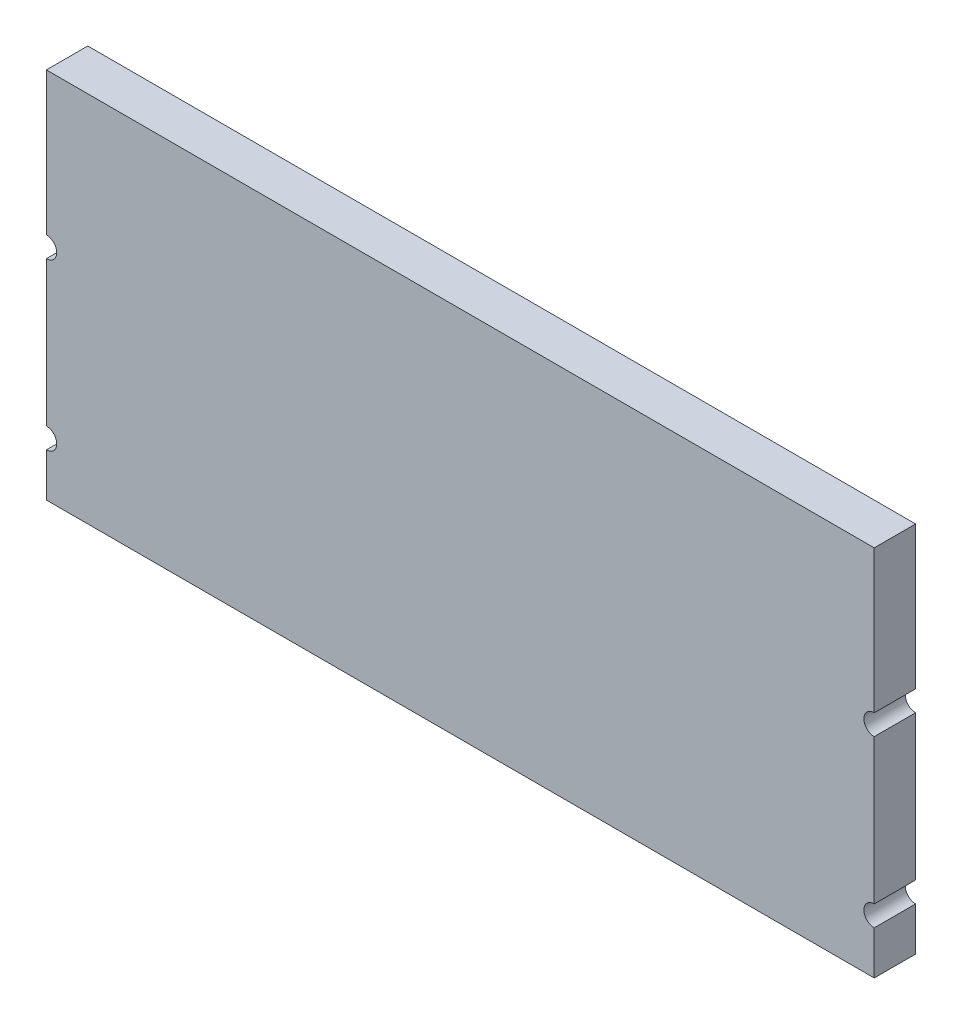
ISO-10303-21;
HEADER;
FILE_DESCRIPTION(('STEP AP214'),'2;1');
FILE_NAME('part.step','',(''),(''),'','','');
FILE_SCHEMA(('AUTOMOTIVE_DESIGN { 1 0 10303 214 1 1 1 1 }'));
ENDSEC;
DATA;
#1=APPLICATION_CONTEXT('core data for automotive mechanical design processes');
#2=APPLICATION_PROTOCOL_DEFINITION('international standard','automotive_design',2000,#1);
#3=PRODUCT_CONTEXT('',#1,'mechanical');
#4=PRODUCT('Part','Part','',(#3));
#5=PRODUCT_RELATED_PRODUCT_CATEGORY('part','',(#4));
#6=PRODUCT_DEFINITION_FORMATION('','',#4);
#7=PRODUCT_DEFINITION_CONTEXT('part definition',#1,'design');
#8=PRODUCT_DEFINITION('design','',#6,#7);
#9=PRODUCT_DEFINITION_SHAPE('','',#8);
#10=(LENGTH_UNIT() NAMED_UNIT(*) SI_UNIT(.MILLI.,.METRE.));
#11=(NAMED_UNIT(*) PLANE_ANGLE_UNIT() SI_UNIT($,.RADIAN.));
#12=(NAMED_UNIT(*) SI_UNIT($,.STERADIAN.) SOLID_ANGLE_UNIT());
#13=UNCERTAINTY_MEASURE_WITH_UNIT(LENGTH_MEASURE(1.E-05),#10,'distance_accuracy_value','');
#14=(GEOMETRIC_REPRESENTATION_CONTEXT(3) GLOBAL_UNCERTAINTY_ASSIGNED_CONTEXT((#13)) GLOBAL_UNIT_ASSIGNED_CONTEXT((#10,
#11,#12)) REPRESENTATION_CONTEXT('',''));
#15=CARTESIAN_POINT('',(0.,0.,0.));
#16=DIRECTION('',(0.,0.,1.));
#17=DIRECTION('',(1.,0.,0.));
#18=AXIS2_PLACEMENT_3D('',#15,#16,#17);
#19=CARTESIAN_POINT('',(127.,-57.15,12.7));
#20=DIRECTION('',(-1.,0.,0.));
#21=DIRECTION('',(0.,0.,1.));
#22=AXIS2_PLACEMENT_3D('',#19,#20,#21);
#23=PLANE('',#22);
#24=DIRECTION('',(0.,1.,0.));
#25=VECTOR('',#24,1.);
#26=CARTESIAN_POINT('',(127.,-57.15,12.7));
#27=LINE('',#26,#25);
#28=CARTESIAN_POINT('',(127.,-37.465,12.7));
#29=VERTEX_POINT('',#28);
#30=CARTESIAN_POINT('',(127.,6.98500000000004,12.7));
#31=VERTEX_POINT('',#30);
#32=EDGE_CURVE('E144',#29,#31,#27,.T.);
#33=ORIENTED_EDGE('',*,*,#32,.F.);
#34=DIRECTION('',(0.,0.,-1.));
#35=VECTOR('',#34,1.);
#36=CARTESIAN_POINT('',(127.,-37.465,21.6802561210692));
#37=LINE('',#36,#35);
#38=CARTESIAN_POINT('',(127.,-37.465,0.));
#39=VERTEX_POINT('',#38);
#40=EDGE_CURVE('E213',#29,#39,#37,.T.);
#41=ORIENTED_EDGE('',*,*,#40,.T.);
#42=DIRECTION('',(0.,1.,0.));
#43=VECTOR('',#42,1.);
#44=CARTESIAN_POINT('',(127.,-57.15,0.));
#45=LINE('',#44,#43);
#46=CARTESIAN_POINT('',(127.,6.98500000000004,0.));
#47=VERTEX_POINT('',#46);
#48=EDGE_CURVE('E146',#39,#47,#45,.T.);
#49=ORIENTED_EDGE('',*,*,#48,.T.);
#50=DIRECTION('',(0.,0.,-1.));
#51=VECTOR('',#50,1.);
#52=CARTESIAN_POINT('',(127.,6.98500000000004,21.6802561210692));
#53=LINE('',#52,#51);
#54=EDGE_CURVE('E131',#47,#31,#53,.F.);
#55=ORIENTED_EDGE('',*,*,#54,.T.);
#56=EDGE_LOOP('',(#33,#41,#49,#55));
#57=FACE_BOUND('',#56,.T.);
#58=ADVANCED_FACE('F40',(#57),#23,.F.);
#59=CARTESIAN_POINT('',(127.,13.335,12.7));
#60=VERTEX_POINT('',#59);
#61=CARTESIAN_POINT('',(127.,57.15,12.7));
#62=VERTEX_POINT('',#61);
#63=EDGE_CURVE('E153',#60,#62,#27,.T.);
#64=ORIENTED_EDGE('',*,*,#63,.F.);
#65=DIRECTION('',(0.,0.,-1.));
#66=VECTOR('',#65,1.);
#67=CARTESIAN_POINT('',(127.,13.335,21.6802561210692));
#68=LINE('',#67,#66);
#69=CARTESIAN_POINT('',(127.,13.335,0.));
#70=VERTEX_POINT('',#69);
#71=EDGE_CURVE('E134',#60,#70,#68,.T.);
#72=ORIENTED_EDGE('',*,*,#71,.T.);
#73=CARTESIAN_POINT('',(127.,57.15,0.));
#74=VERTEX_POINT('',#73);
#75=EDGE_CURVE('E173',#70,#74,#45,.T.);
#76=ORIENTED_EDGE('',*,*,#75,.T.);
#77=DIRECTION('',(0.,0.,-1.));
#78=VECTOR('',#77,1.);
#79=CARTESIAN_POINT('',(127.,57.15,12.7));
#80=LINE('',#79,#78);
#81=EDGE_CURVE('E189',#62,#74,#80,.T.);
#82=ORIENTED_EDGE('',*,*,#81,.F.);
#83=EDGE_LOOP('',(#64,#72,#76,#82));
#84=FACE_BOUND('',#83,.T.);
#85=ADVANCED_FACE('F194',(#84),#23,.F.);
#86=CARTESIAN_POINT('',(-127.,-57.15,12.7));
#87=DIRECTION('',(1.,0.,0.));
#88=DIRECTION('',(0.,0.,-1.));
#89=AXIS2_PLACEMENT_3D('',#86,#87,#88);
#90=PLANE('',#89);
#91=DIRECTION('',(0.,-1.,0.));
#92=VECTOR('',#91,1.);
#93=CARTESIAN_POINT('',(-127.,-57.15,12.7));
#94=LINE('',#93,#92);
#95=CARTESIAN_POINT('',(-127.,6.98500000000001,12.7));
#96=VERTEX_POINT('',#95);
#97=CARTESIAN_POINT('',(-127.,-37.465,12.7));
#98=VERTEX_POINT('',#97);
#99=EDGE_CURVE('E166',#96,#98,#94,.T.);
#100=ORIENTED_EDGE('',*,*,#99,.F.);
#101=DIRECTION('',(0.,0.,-1.));
#102=VECTOR('',#101,1.);
#103=CARTESIAN_POINT('',(-127.,6.98500000000001,21.6802561210692));
#104=LINE('',#103,#102);
#105=CARTESIAN_POINT('',(-127.,6.98500000000001,0.));
#106=VERTEX_POINT('',#105);
#107=EDGE_CURVE('E159',#96,#106,#104,.T.);
#108=ORIENTED_EDGE('',*,*,#107,.T.);
#109=DIRECTION('',(0.,-1.,0.));
#110=VECTOR('',#109,1.);
#111=CARTESIAN_POINT('',(-127.,-57.15,0.));
#112=LINE('',#111,#110);
#113=CARTESIAN_POINT('',(-127.,-37.465,0.));
#114=VERTEX_POINT('',#113);
#115=EDGE_CURVE('E179',#106,#114,#112,.T.);
#116=ORIENTED_EDGE('',*,*,#115,.T.);
#117=DIRECTION('',(0.,0.,-1.));
#118=VECTOR('',#117,1.);
#119=CARTESIAN_POINT('',(-127.,-37.465,21.6802561210692));
#120=LINE('',#119,#118);
#121=EDGE_CURVE('E55',#114,#98,#120,.F.);
#122=ORIENTED_EDGE('',*,*,#121,.T.);
#123=EDGE_LOOP('',(#100,#108,#116,#122));
#124=FACE_BOUND('',#123,.T.);
#125=ADVANCED_FACE('F233',(#124),#90,.F.);
#126=CARTESIAN_POINT('',(-127.,-43.815,12.7));
#127=VERTEX_POINT('',#126);
#128=CARTESIAN_POINT('',(-127.,-57.15,12.7));
#129=VERTEX_POINT('',#128);
#130=EDGE_CURVE('E162',#127,#129,#94,.T.);
#131=ORIENTED_EDGE('',*,*,#130,.F.);
#132=DIRECTION('',(0.,0.,-1.));
#133=VECTOR('',#132,1.);
#134=CARTESIAN_POINT('',(-127.,-43.815,21.6802561210692));
#135=LINE('',#134,#133);
#136=CARTESIAN_POINT('',(-127.,-43.815,0.));
#137=VERTEX_POINT('',#136);
#138=EDGE_CURVE('E206',#127,#137,#135,.T.);
#139=ORIENTED_EDGE('',*,*,#138,.T.);
#140=CARTESIAN_POINT('',(-127.,-57.15,0.));
#141=VERTEX_POINT('',#140);
#142=EDGE_CURVE('E175',#137,#141,#112,.T.);
#143=ORIENTED_EDGE('',*,*,#142,.T.);
#144=DIRECTION('',(0.,0.,-1.));
#145=VECTOR('',#144,1.);
#146=CARTESIAN_POINT('',(-127.,-57.15,12.7));
#147=LINE('',#146,#145);
#148=EDGE_CURVE('E183',#129,#141,#147,.T.);
#149=ORIENTED_EDGE('',*,*,#148,.F.);
#150=EDGE_LOOP('',(#131,#139,#143,#149));
#151=FACE_BOUND('',#150,.T.);
#152=ADVANCED_FACE('F239',(#151),#90,.F.);
#153=CARTESIAN_POINT('',(127.,-57.15,0.));
#154=VERTEX_POINT('',#153);
#155=CARTESIAN_POINT('',(127.,-43.815,0.));
#156=VERTEX_POINT('',#155);
#157=EDGE_CURVE('E169',#154,#156,#45,.T.);
#158=ORIENTED_EDGE('',*,*,#157,.T.);
#159=DIRECTION('',(0.,0.,-1.));
#160=VECTOR('',#159,1.);
#161=CARTESIAN_POINT('',(127.,-43.815,21.6802561210692));
#162=LINE('',#161,#160);
#163=CARTESIAN_POINT('',(127.,-43.815,12.7));
#164=VERTEX_POINT('',#163);
#165=EDGE_CURVE('E197',#156,#164,#162,.F.);
#166=ORIENTED_EDGE('',*,*,#165,.T.);
#167=CARTESIAN_POINT('',(127.,-57.15,12.7));
#168=VERTEX_POINT('',#167);
#169=EDGE_CURVE('E152',#168,#164,#27,.T.);
#170=ORIENTED_EDGE('',*,*,#169,.F.);
#171=DIRECTION('',(0.,0.,-1.));
#172=VECTOR('',#171,1.);
#173=CARTESIAN_POINT('',(127.,-57.15,12.7));
#174=LINE('',#173,#172);
#175=EDGE_CURVE('E168',#168,#154,#174,.T.);
#176=ORIENTED_EDGE('',*,*,#175,.T.);
#177=EDGE_LOOP('',(#158,#166,#170,#176));
#178=FACE_BOUND('',#177,.T.);
#179=ADVANCED_FACE('F42',(#178),#23,.F.);
#180=CARTESIAN_POINT('',(-127.,57.15,12.7));
#181=DIRECTION('',(0.,-1.,0.));
#182=DIRECTION('',(0.,0.,-1.));
#183=AXIS2_PLACEMENT_3D('',#180,#181,#182);
#184=PLANE('',#183);
#185=DIRECTION('',(-1.,0.,0.));
#186=VECTOR('',#185,1.);
#187=CARTESIAN_POINT('',(-127.,57.15,0.));
#188=LINE('',#187,#186);
#189=CARTESIAN_POINT('',(-127.,57.15,0.));
#190=VERTEX_POINT('',#189);
#191=EDGE_CURVE('E172',#74,#190,#188,.T.);
#192=ORIENTED_EDGE('',*,*,#191,.T.);
#193=DIRECTION('',(0.,0.,-1.));
#194=VECTOR('',#193,1.);
#195=CARTESIAN_POINT('',(-127.,57.15,12.7));
#196=LINE('',#195,#194);
#197=CARTESIAN_POINT('',(-127.,57.15,12.7));
#198=VERTEX_POINT('',#197);
#199=EDGE_CURVE('E186',#198,#190,#196,.T.);
#200=ORIENTED_EDGE('',*,*,#199,.F.);
#201=DIRECTION('',(-1.,0.,0.));
#202=VECTOR('',#201,1.);
#203=CARTESIAN_POINT('',(-127.,57.15,12.7));
#204=LINE('',#203,#202);
#205=EDGE_CURVE('E155',#62,#198,#204,.T.);
#206=ORIENTED_EDGE('',*,*,#205,.F.);
#207=ORIENTED_EDGE('',*,*,#81,.T.);
#208=EDGE_LOOP('',(#192,#200,#206,#207));
#209=FACE_BOUND('',#208,.T.);
#210=ADVANCED_FACE('F230',(#209),#184,.F.);
#211=CARTESIAN_POINT('',(-127.,13.335,0.));
#212=VERTEX_POINT('',#211);
#213=EDGE_CURVE('E176',#190,#212,#112,.T.);
#214=ORIENTED_EDGE('',*,*,#213,.T.);
#215=DIRECTION('',(0.,0.,-1.));
#216=VECTOR('',#215,1.);
#217=CARTESIAN_POINT('',(-127.,13.335,21.6802561210692));
#218=LINE('',#217,#216);
#219=CARTESIAN_POINT('',(-127.,13.335,12.7));
#220=VERTEX_POINT('',#219);
#221=EDGE_CURVE('E63',#212,#220,#218,.F.);
#222=ORIENTED_EDGE('',*,*,#221,.T.);
#223=EDGE_CURVE('E163',#198,#220,#94,.T.);
#224=ORIENTED_EDGE('',*,*,#223,.F.);
#225=ORIENTED_EDGE('',*,*,#199,.T.);
#226=EDGE_LOOP('',(#214,#222,#224,#225));
#227=FACE_BOUND('',#226,.T.);
#228=ADVANCED_FACE('F226',(#227),#90,.F.);
#229=CARTESIAN_POINT('',(-127.,-57.15,12.7));
#230=DIRECTION('',(0.,1.,0.));
#231=DIRECTION('',(0.,0.,1.));
#232=AXIS2_PLACEMENT_3D('',#229,#230,#231);
#233=PLANE('',#232);
#234=DIRECTION('',(1.,0.,0.));
#235=VECTOR('',#234,1.);
#236=CARTESIAN_POINT('',(-127.,-57.15,0.));
#237=LINE('',#236,#235);
#238=EDGE_CURVE('E156',#141,#154,#237,.T.);
#239=ORIENTED_EDGE('',*,*,#238,.T.);
#240=ORIENTED_EDGE('',*,*,#175,.F.);
#241=DIRECTION('',(1.,0.,0.));
#242=VECTOR('',#241,1.);
#243=CARTESIAN_POINT('',(-127.,-57.15,12.7));
#244=LINE('',#243,#242);
#245=EDGE_CURVE('E165',#129,#168,#244,.T.);
#246=ORIENTED_EDGE('',*,*,#245,.F.);
#247=ORIENTED_EDGE('',*,*,#148,.T.);
#248=EDGE_LOOP('',(#239,#240,#246,#247));
#249=FACE_BOUND('',#248,.T.);
#250=ADVANCED_FACE('F243',(#249),#233,.F.);
#251=CARTESIAN_POINT('',(0.,0.,12.7));
#252=DIRECTION('',(0.,0.,-1.));
#253=DIRECTION('',(-1.,0.,0.));
#254=AXIS2_PLACEMENT_3D('',#251,#252,#253);
#255=PLANE('',#254);
#256=ORIENTED_EDGE('',*,*,#223,.T.);
#257=CARTESIAN_POINT('',(-127.,10.16,12.7));
#258=DIRECTION('',(0.,0.,-1.));
#259=DIRECTION('',(-1.,0.,0.));
#260=AXIS2_PLACEMENT_3D('',#257,#258,#259);
#261=CIRCLE('',#260,3.175);
#262=EDGE_CURVE('E147',#96,#220,#261,.F.);
#263=ORIENTED_EDGE('',*,*,#262,.F.);
#264=ORIENTED_EDGE('',*,*,#99,.T.);
#265=CARTESIAN_POINT('',(-127.,-40.64,12.7));
#266=DIRECTION('',(0.,0.,-1.));
#267=DIRECTION('',(-1.,0.,0.));
#268=AXIS2_PLACEMENT_3D('',#265,#266,#267);
#269=CIRCLE('',#268,3.175);
#270=EDGE_CURVE('E218',#127,#98,#269,.F.);
#271=ORIENTED_EDGE('',*,*,#270,.F.);
#272=ORIENTED_EDGE('',*,*,#130,.T.);
#273=ORIENTED_EDGE('',*,*,#245,.T.);
#274=ORIENTED_EDGE('',*,*,#169,.T.);
#275=CARTESIAN_POINT('',(127.,-40.64,12.7));
#276=DIRECTION('',(0.,0.,-1.));
#277=DIRECTION('',(-1.,0.,0.));
#278=AXIS2_PLACEMENT_3D('',#275,#276,#277);
#279=CIRCLE('',#278,3.175);
#280=EDGE_CURVE('E138',#29,#164,#279,.F.);
#281=ORIENTED_EDGE('',*,*,#280,.F.);
#282=ORIENTED_EDGE('',*,*,#32,.T.);
#283=CARTESIAN_POINT('',(127.,10.16,12.7));
#284=DIRECTION('',(0.,0.,-1.));
#285=DIRECTION('',(-1.,0.,0.));
#286=AXIS2_PLACEMENT_3D('',#283,#284,#285);
#287=CIRCLE('',#286,3.175);
#288=EDGE_CURVE('E128',#60,#31,#287,.F.);
#289=ORIENTED_EDGE('',*,*,#288,.F.);
#290=ORIENTED_EDGE('',*,*,#63,.T.);
#291=ORIENTED_EDGE('',*,*,#205,.T.);
#292=EDGE_LOOP('',(#256,#263,#264,#271,#272,#273,#274,#281,#282,#289,#290,#291));
#293=FACE_BOUND('',#292,.T.);
#294=ADVANCED_FACE('F150',(#293),#255,.F.);
#295=CARTESIAN_POINT('',(0.,0.,0.));
#296=DIRECTION('',(0.,0.,-1.));
#297=DIRECTION('',(-1.,0.,0.));
#298=AXIS2_PLACEMENT_3D('',#295,#296,#297);
#299=PLANE('',#298);
#300=CARTESIAN_POINT('',(-127.,10.16,0.));
#301=DIRECTION('',(0.,0.,-1.));
#302=DIRECTION('',(-1.,0.,0.));
#303=AXIS2_PLACEMENT_3D('',#300,#301,#302);
#304=CIRCLE('',#303,3.175);
#305=EDGE_CURVE('E221',#212,#106,#304,.T.);
#306=ORIENTED_EDGE('',*,*,#305,.F.);
#307=ORIENTED_EDGE('',*,*,#213,.F.);
#308=ORIENTED_EDGE('',*,*,#191,.F.);
#309=ORIENTED_EDGE('',*,*,#75,.F.);
#310=CARTESIAN_POINT('',(127.,10.16,0.));
#311=DIRECTION('',(0.,0.,-1.));
#312=DIRECTION('',(-1.,0.,0.));
#313=AXIS2_PLACEMENT_3D('',#310,#311,#312);
#314=CIRCLE('',#313,3.175);
#315=EDGE_CURVE('E48',#47,#70,#314,.T.);
#316=ORIENTED_EDGE('',*,*,#315,.F.);
#317=ORIENTED_EDGE('',*,*,#48,.F.);
#318=CARTESIAN_POINT('',(127.,-40.64,0.));
#319=DIRECTION('',(0.,0.,-1.));
#320=DIRECTION('',(-1.,0.,0.));
#321=AXIS2_PLACEMENT_3D('',#318,#319,#320);
#322=CIRCLE('',#321,3.175);
#323=EDGE_CURVE('E11',#156,#39,#322,.T.);
#324=ORIENTED_EDGE('',*,*,#323,.F.);
#325=ORIENTED_EDGE('',*,*,#157,.F.);
#326=ORIENTED_EDGE('',*,*,#238,.F.);
#327=ORIENTED_EDGE('',*,*,#142,.F.);
#328=CARTESIAN_POINT('',(-127.,-40.64,0.));
#329=DIRECTION('',(0.,0.,-1.));
#330=DIRECTION('',(-1.,0.,0.));
#331=AXIS2_PLACEMENT_3D('',#328,#329,#330);
#332=CIRCLE('',#331,3.175);
#333=EDGE_CURVE('E219',#114,#137,#332,.T.);
#334=ORIENTED_EDGE('',*,*,#333,.F.);
#335=ORIENTED_EDGE('',*,*,#115,.F.);
#336=EDGE_LOOP('',(#306,#307,#308,#309,#316,#317,#324,#325,#326,#327,#334,#335));
#337=FACE_BOUND('',#336,.T.);
#338=ADVANCED_FACE('F199',(#337),#299,.T.);
#339=CARTESIAN_POINT('',(127.,10.16,21.6802561210692));
#340=DIRECTION('',(0.,0.,-1.));
#341=DIRECTION('',(-1.,0.,0.));
#342=AXIS2_PLACEMENT_3D('',#339,#340,#341);
#343=CYLINDRICAL_SURFACE('',#342,3.175);
#344=ORIENTED_EDGE('',*,*,#288,.T.);
#345=ORIENTED_EDGE('',*,*,#54,.F.);
#346=ORIENTED_EDGE('',*,*,#315,.T.);
#347=ORIENTED_EDGE('',*,*,#71,.F.);
#348=EDGE_LOOP('',(#344,#345,#346,#347));
#349=FACE_BOUND('',#348,.T.);
#350=ADVANCED_FACE('F130',(#349),#343,.F.);
#351=CARTESIAN_POINT('',(127.,-40.64,21.6802561210692));
#352=DIRECTION('',(0.,0.,-1.));
#353=DIRECTION('',(-1.,0.,0.));
#354=AXIS2_PLACEMENT_3D('',#351,#352,#353);
#355=CYLINDRICAL_SURFACE('',#354,3.175);
#356=ORIENTED_EDGE('',*,*,#280,.T.);
#357=ORIENTED_EDGE('',*,*,#165,.F.);
#358=ORIENTED_EDGE('',*,*,#323,.T.);
#359=ORIENTED_EDGE('',*,*,#40,.F.);
#360=EDGE_LOOP('',(#356,#357,#358,#359));
#361=FACE_BOUND('',#360,.T.);
#362=ADVANCED_FACE('F249',(#361),#355,.F.);
#363=CARTESIAN_POINT('',(-127.,-40.64,21.6802561210692));
#364=DIRECTION('',(0.,0.,-1.));
#365=DIRECTION('',(-1.,0.,0.));
#366=AXIS2_PLACEMENT_3D('',#363,#364,#365);
#367=CYLINDRICAL_SURFACE('',#366,3.175);
#368=ORIENTED_EDGE('',*,*,#270,.T.);
#369=ORIENTED_EDGE('',*,*,#121,.F.);
#370=ORIENTED_EDGE('',*,*,#333,.T.);
#371=ORIENTED_EDGE('',*,*,#138,.F.);
#372=EDGE_LOOP('',(#368,#369,#370,#371));
#373=FACE_BOUND('',#372,.T.);
#374=ADVANCED_FACE('F250',(#373),#367,.F.);
#375=CARTESIAN_POINT('',(-127.,10.16,21.6802561210692));
#376=DIRECTION('',(0.,0.,-1.));
#377=DIRECTION('',(-1.,0.,0.));
#378=AXIS2_PLACEMENT_3D('',#375,#376,#377);
#379=CYLINDRICAL_SURFACE('',#378,3.175);
#380=ORIENTED_EDGE('',*,*,#262,.T.);
#381=ORIENTED_EDGE('',*,*,#221,.F.);
#382=ORIENTED_EDGE('',*,*,#305,.T.);
#383=ORIENTED_EDGE('',*,*,#107,.F.);
#384=EDGE_LOOP('',(#380,#381,#382,#383));
#385=FACE_BOUND('',#384,.T.);
#386=ADVANCED_FACE('F224',(#385),#379,.F.);
#387=CLOSED_SHELL('',(#58,#85,#125,#152,#179,#210,#228,#250,#294,#338,#350,#362,#374,#386));
#388=MANIFOLD_SOLID_BREP('B2',#387);
#389=ADVANCED_BREP_SHAPE_REPRESENTATION('',(#18,#388),#14);
#390=SHAPE_DEFINITION_REPRESENTATION(#9,#389);
ENDSEC;
END-ISO-10303-21;
